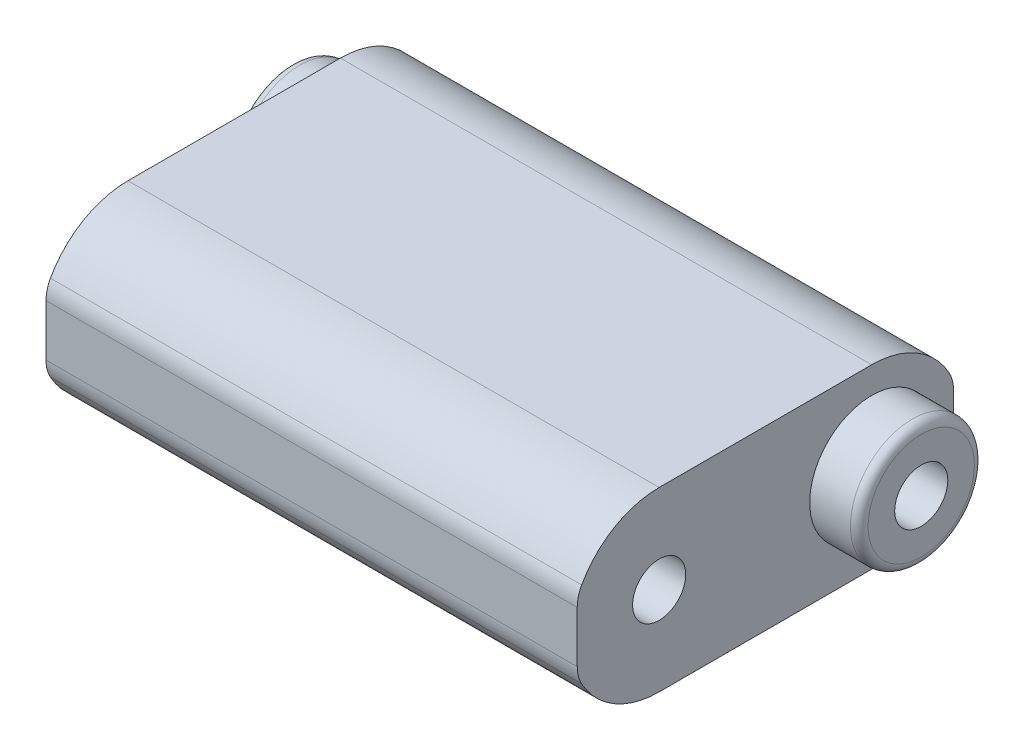
ISO-10303-21;
HEADER;
FILE_DESCRIPTION(('STEP AP214'),'2;1');
FILE_NAME('part.step','',(''),(''),'','','');
FILE_SCHEMA(('AUTOMOTIVE_DESIGN { 1 0 10303 214 1 1 1 1 }'));
ENDSEC;
DATA;
#1=APPLICATION_CONTEXT('core data for automotive mechanical design processes');
#2=APPLICATION_PROTOCOL_DEFINITION('international standard','automotive_design',2000,#1);
#3=PRODUCT_CONTEXT('',#1,'mechanical');
#4=PRODUCT('Part','Part','',(#3));
#5=PRODUCT_RELATED_PRODUCT_CATEGORY('part','',(#4));
#6=PRODUCT_DEFINITION_FORMATION('','',#4);
#7=PRODUCT_DEFINITION_CONTEXT('part definition',#1,'design');
#8=PRODUCT_DEFINITION('design','',#6,#7);
#9=PRODUCT_DEFINITION_SHAPE('','',#8);
#10=(LENGTH_UNIT() NAMED_UNIT(*) SI_UNIT(.MILLI.,.METRE.));
#11=(NAMED_UNIT(*) PLANE_ANGLE_UNIT() SI_UNIT($,.RADIAN.));
#12=(NAMED_UNIT(*) SI_UNIT($,.STERADIAN.) SOLID_ANGLE_UNIT());
#13=UNCERTAINTY_MEASURE_WITH_UNIT(LENGTH_MEASURE(1.E-05),#10,'distance_accuracy_value','');
#14=(GEOMETRIC_REPRESENTATION_CONTEXT(3) GLOBAL_UNCERTAINTY_ASSIGNED_CONTEXT((#13)) GLOBAL_UNIT_ASSIGNED_CONTEXT((#10,
#11,#12)) REPRESENTATION_CONTEXT('',''));
#15=CARTESIAN_POINT('',(0.,0.,0.));
#16=DIRECTION('',(0.,0.,1.));
#17=DIRECTION('',(1.,0.,0.));
#18=AXIS2_PLACEMENT_3D('',#15,#16,#17);
#19=CARTESIAN_POINT('',(300.,0.,0.));
#20=DIRECTION('',(1.,0.,0.));
#21=DIRECTION('',(0.,0.,-1.));
#22=AXIS2_PLACEMENT_3D('',#19,#20,#21);
#23=PLANE('',#22);
#24=DIRECTION('',(0.,-1.,0.));
#25=VECTOR('',#24,1.);
#26=CARTESIAN_POINT('',(300.,0.,106.249324319389));
#27=LINE('',#26,#25);
#28=CARTESIAN_POINT('',(300.,14.5249087011089,106.249324319389));
#29=VERTEX_POINT('',#28);
#30=CARTESIAN_POINT('',(300.,-14.5249087011089,106.249324319389));
#31=VERTEX_POINT('',#30);
#32=EDGE_CURVE('E170',#29,#31,#27,.T.);
#33=ORIENTED_EDGE('',*,*,#32,.T.);
#34=CARTESIAN_POINT('',(300.,-14.5249087011089,86.2493243193887));
#35=DIRECTION('',(1.,0.,0.));
#36=DIRECTION('',(0.,0.,-1.));
#37=AXIS2_PLACEMENT_3D('',#34,#35,#36);
#38=CIRCLE('',#37,20.);
#39=CARTESIAN_POINT('',(300.,-24.2081811685148,103.748873865648));
#40=VERTEX_POINT('',#39);
#41=EDGE_CURVE('E139',#31,#40,#38,.T.);
#42=ORIENTED_EDGE('',*,*,#41,.T.);
#43=CARTESIAN_POINT('',(300.,0.,60.));
#44=DIRECTION('',(1.,0.,0.));
#45=DIRECTION('',(0.,0.,-1.));
#46=AXIS2_PLACEMENT_3D('',#43,#44,#45);
#47=CIRCLE('',#46,50.);
#48=CARTESIAN_POINT('',(300.,-50.,60.));
#49=VERTEX_POINT('',#48);
#50=EDGE_CURVE('E131',#40,#49,#47,.T.);
#51=ORIENTED_EDGE('',*,*,#50,.T.);
#52=DIRECTION('',(0.,0.,1.));
#53=VECTOR('',#52,1.);
#54=CARTESIAN_POINT('',(300.,-50.,0.));
#55=LINE('',#54,#53);
#56=CARTESIAN_POINT('',(300.,-50.,-60.));
#57=VERTEX_POINT('',#56);
#58=EDGE_CURVE('E137',#57,#49,#55,.T.);
#59=ORIENTED_EDGE('',*,*,#58,.F.);
#60=CARTESIAN_POINT('',(300.,0.,-60.));
#61=DIRECTION('',(1.,0.,0.));
#62=DIRECTION('',(0.,0.,-1.));
#63=AXIS2_PLACEMENT_3D('',#60,#61,#62);
#64=CIRCLE('',#63,50.);
#65=CARTESIAN_POINT('',(300.,-24.2081811685148,-103.748873865648));
#66=VERTEX_POINT('',#65);
#67=EDGE_CURVE('E159',#57,#66,#64,.T.);
#68=ORIENTED_EDGE('',*,*,#67,.T.);
#69=CARTESIAN_POINT('',(300.,-14.5249087011089,-86.2493243193887));
#70=DIRECTION('',(1.,0.,0.));
#71=DIRECTION('',(0.,0.,-1.));
#72=AXIS2_PLACEMENT_3D('',#69,#70,#71);
#73=CIRCLE('',#72,20.);
#74=CARTESIAN_POINT('',(300.,-14.5249087011089,-106.249324319389));
#75=VERTEX_POINT('',#74);
#76=EDGE_CURVE('E225',#66,#75,#73,.T.);
#77=ORIENTED_EDGE('',*,*,#76,.T.);
#78=DIRECTION('',(0.,-1.,0.));
#79=VECTOR('',#78,1.);
#80=CARTESIAN_POINT('',(300.,0.,-106.249324319389));
#81=LINE('',#80,#79);
#82=CARTESIAN_POINT('',(300.,14.5249087011089,-106.249324319389));
#83=VERTEX_POINT('',#82);
#84=EDGE_CURVE('E161',#83,#75,#81,.T.);
#85=ORIENTED_EDGE('',*,*,#84,.F.);
#86=CARTESIAN_POINT('',(300.,14.5249087011089,-86.2493243193887));
#87=DIRECTION('',(1.,0.,0.));
#88=DIRECTION('',(0.,0.,-1.));
#89=AXIS2_PLACEMENT_3D('',#86,#87,#88);
#90=CIRCLE('',#89,20.);
#91=CARTESIAN_POINT('',(300.,24.2081811685149,-103.748873865648));
#92=VERTEX_POINT('',#91);
#93=EDGE_CURVE('E63',#83,#92,#90,.T.);
#94=ORIENTED_EDGE('',*,*,#93,.T.);
#95=CARTESIAN_POINT('',(300.,50.,-60.));
#96=VERTEX_POINT('',#95);
#97=EDGE_CURVE('E163',#92,#96,#64,.T.);
#98=ORIENTED_EDGE('',*,*,#97,.T.);
#99=DIRECTION('',(0.,0.,1.));
#100=VECTOR('',#99,1.);
#101=CARTESIAN_POINT('',(300.,50.,0.));
#102=LINE('',#101,#100);
#103=CARTESIAN_POINT('',(300.,50.,60.));
#104=VERTEX_POINT('',#103);
#105=EDGE_CURVE('E168',#96,#104,#102,.T.);
#106=ORIENTED_EDGE('',*,*,#105,.T.);
#107=CARTESIAN_POINT('',(300.,24.2081811685148,103.748873865648));
#108=VERTEX_POINT('',#107);
#109=EDGE_CURVE('E145',#104,#108,#47,.T.);
#110=ORIENTED_EDGE('',*,*,#109,.T.);
#111=CARTESIAN_POINT('',(300.,14.5249087011089,86.2493243193887));
#112=DIRECTION('',(1.,0.,0.));
#113=DIRECTION('',(0.,0.,-1.));
#114=AXIS2_PLACEMENT_3D('',#111,#112,#113);
#115=CIRCLE('',#114,20.);
#116=EDGE_CURVE('E227',#108,#29,#115,.T.);
#117=ORIENTED_EDGE('',*,*,#116,.T.);
#118=EDGE_LOOP('',(#33,#42,#51,#59,#68,#77,#85,#94,#98,#106,#110,#117));
#119=FACE_BOUND('',#118,.T.);
#120=CARTESIAN_POINT('',(300.,0.,60.));
#121=DIRECTION('',(-1.,0.,0.));
#122=DIRECTION('',(0.,0.,1.));
#123=AXIS2_PLACEMENT_3D('',#120,#121,#122);
#124=CIRCLE('',#123,15.);
#125=CARTESIAN_POINT('',(300.,0.,75.));
#126=VERTEX_POINT('',#125);
#127=EDGE_CURVE('E175',#126,#126,#124,.T.);
#128=ORIENTED_EDGE('',*,*,#127,.T.);
#129=EDGE_LOOP('',(#128));
#130=FACE_BOUND('',#129,.T.);
#131=CARTESIAN_POINT('',(300.,0.,-60.));
#132=DIRECTION('',(1.,0.,0.));
#133=DIRECTION('',(0.,0.,-1.));
#134=AXIS2_PLACEMENT_3D('',#131,#132,#133);
#135=CIRCLE('',#134,35.);
#136=CARTESIAN_POINT('',(300.,0.,-95.));
#137=VERTEX_POINT('',#136);
#138=EDGE_CURVE('E314',#137,#137,#135,.T.);
#139=ORIENTED_EDGE('',*,*,#138,.F.);
#140=EDGE_LOOP('',(#139));
#141=FACE_BOUND('',#140,.T.);
#142=ADVANCED_FACE('F40',(#119,#130,#141),#23,.T.);
#143=CARTESIAN_POINT('',(0.,0.,0.));
#144=DIRECTION('',(1.,0.,0.));
#145=DIRECTION('',(0.,0.,-1.));
#146=AXIS2_PLACEMENT_3D('',#143,#144,#145);
#147=PLANE('',#146);
#148=CARTESIAN_POINT('',(0.,0.,60.));
#149=DIRECTION('',(1.,0.,0.));
#150=DIRECTION('',(0.,0.,-1.));
#151=AXIS2_PLACEMENT_3D('',#148,#149,#150);
#152=CIRCLE('',#151,50.);
#153=CARTESIAN_POINT('',(0.,-24.2081811685148,103.748873865648));
#154=VERTEX_POINT('',#153);
#155=CARTESIAN_POINT('',(0.,-50.,60.));
#156=VERTEX_POINT('',#155);
#157=EDGE_CURVE('E150',#154,#156,#152,.T.);
#158=ORIENTED_EDGE('',*,*,#157,.F.);
#159=CARTESIAN_POINT('',(0.,-14.5249087011089,86.2493243193887));
#160=DIRECTION('',(1.,0.,0.));
#161=DIRECTION('',(0.,0.,-1.));
#162=AXIS2_PLACEMENT_3D('',#159,#160,#161);
#163=CIRCLE('',#162,20.);
#164=CARTESIAN_POINT('',(0.,-14.5249087011089,106.249324319389));
#165=VERTEX_POINT('',#164);
#166=EDGE_CURVE('E217',#154,#165,#163,.F.);
#167=ORIENTED_EDGE('',*,*,#166,.T.);
#168=DIRECTION('',(0.,-1.,0.));
#169=VECTOR('',#168,1.);
#170=CARTESIAN_POINT('',(0.,0.,106.249324319389));
#171=LINE('',#170,#169);
#172=CARTESIAN_POINT('',(0.,14.5249087011089,106.249324319389));
#173=VERTEX_POINT('',#172);
#174=EDGE_CURVE('E143',#173,#165,#171,.T.);
#175=ORIENTED_EDGE('',*,*,#174,.F.);
#176=CARTESIAN_POINT('',(0.,14.5249087011089,86.2493243193887));
#177=DIRECTION('',(1.,0.,0.));
#178=DIRECTION('',(0.,0.,-1.));
#179=AXIS2_PLACEMENT_3D('',#176,#177,#178);
#180=CIRCLE('',#179,20.);
#181=CARTESIAN_POINT('',(0.,24.2081811685148,103.748873865648));
#182=VERTEX_POINT('',#181);
#183=EDGE_CURVE('E215',#173,#182,#180,.F.);
#184=ORIENTED_EDGE('',*,*,#183,.T.);
#185=CARTESIAN_POINT('',(0.,50.,60.));
#186=VERTEX_POINT('',#185);
#187=EDGE_CURVE('E176',#186,#182,#152,.T.);
#188=ORIENTED_EDGE('',*,*,#187,.F.);
#189=DIRECTION('',(0.,0.,1.));
#190=VECTOR('',#189,1.);
#191=CARTESIAN_POINT('',(0.,50.,0.));
#192=LINE('',#191,#190);
#193=CARTESIAN_POINT('',(0.,50.,-60.));
#194=VERTEX_POINT('',#193);
#195=EDGE_CURVE('E185',#194,#186,#192,.T.);
#196=ORIENTED_EDGE('',*,*,#195,.F.);
#197=CARTESIAN_POINT('',(0.,0.,-60.));
#198=DIRECTION('',(1.,0.,0.));
#199=DIRECTION('',(0.,0.,-1.));
#200=AXIS2_PLACEMENT_3D('',#197,#198,#199);
#201=CIRCLE('',#200,50.);
#202=CARTESIAN_POINT('',(0.,24.2081811685149,-103.748873865648));
#203=VERTEX_POINT('',#202);
#204=EDGE_CURVE('E182',#203,#194,#201,.T.);
#205=ORIENTED_EDGE('',*,*,#204,.F.);
#206=CARTESIAN_POINT('',(0.,14.5249087011089,-86.2493243193887));
#207=DIRECTION('',(1.,0.,0.));
#208=DIRECTION('',(0.,0.,-1.));
#209=AXIS2_PLACEMENT_3D('',#206,#207,#208);
#210=CIRCLE('',#209,20.);
#211=CARTESIAN_POINT('',(0.,14.5249087011089,-106.249324319389));
#212=VERTEX_POINT('',#211);
#213=EDGE_CURVE('E211',#203,#212,#210,.F.);
#214=ORIENTED_EDGE('',*,*,#213,.T.);
#215=DIRECTION('',(0.,-1.,0.));
#216=VECTOR('',#215,1.);
#217=CARTESIAN_POINT('',(0.,0.,-106.249324319389));
#218=LINE('',#217,#216);
#219=CARTESIAN_POINT('',(0.,-14.5249087011089,-106.249324319389));
#220=VERTEX_POINT('',#219);
#221=EDGE_CURVE('E181',#212,#220,#218,.T.);
#222=ORIENTED_EDGE('',*,*,#221,.T.);
#223=CARTESIAN_POINT('',(0.,-14.5249087011089,-86.2493243193887));
#224=DIRECTION('',(1.,0.,0.));
#225=DIRECTION('',(0.,0.,-1.));
#226=AXIS2_PLACEMENT_3D('',#223,#224,#225);
#227=CIRCLE('',#226,20.);
#228=CARTESIAN_POINT('',(0.,-24.2081811685148,-103.748873865648));
#229=VERTEX_POINT('',#228);
#230=EDGE_CURVE('E213',#220,#229,#227,.F.);
#231=ORIENTED_EDGE('',*,*,#230,.T.);
#232=CARTESIAN_POINT('',(0.,-50.,-60.));
#233=VERTEX_POINT('',#232);
#234=EDGE_CURVE('E178',#233,#229,#201,.T.);
#235=ORIENTED_EDGE('',*,*,#234,.F.);
#236=DIRECTION('',(0.,0.,1.));
#237=VECTOR('',#236,1.);
#238=CARTESIAN_POINT('',(0.,-50.,0.));
#239=LINE('',#238,#237);
#240=EDGE_CURVE('E174',#233,#156,#239,.T.);
#241=ORIENTED_EDGE('',*,*,#240,.T.);
#242=EDGE_LOOP('',(#158,#167,#175,#184,#188,#196,#205,#214,#222,#231,#235,#241));
#243=FACE_BOUND('',#242,.T.);
#244=CARTESIAN_POINT('',(0.,0.,60.));
#245=DIRECTION('',(-1.,0.,0.));
#246=DIRECTION('',(0.,0.,1.));
#247=AXIS2_PLACEMENT_3D('',#244,#245,#246);
#248=CIRCLE('',#247,15.);
#249=CARTESIAN_POINT('',(0.,0.,75.));
#250=VERTEX_POINT('',#249);
#251=EDGE_CURVE('E322',#250,#250,#248,.T.);
#252=ORIENTED_EDGE('',*,*,#251,.F.);
#253=EDGE_LOOP('',(#252));
#254=FACE_BOUND('',#253,.T.);
#255=CARTESIAN_POINT('',(0.,0.,-60.));
#256=DIRECTION('',(1.,0.,0.));
#257=DIRECTION('',(0.,0.,-1.));
#258=AXIS2_PLACEMENT_3D('',#255,#256,#257);
#259=CIRCLE('',#258,35.);
#260=CARTESIAN_POINT('',(0.,0.,-95.));
#261=VERTEX_POINT('',#260);
#262=EDGE_CURVE('E154',#261,#261,#259,.F.);
#263=ORIENTED_EDGE('',*,*,#262,.F.);
#264=EDGE_LOOP('',(#263));
#265=FACE_BOUND('',#264,.T.);
#266=ADVANCED_FACE('F248',(#243,#254,#265),#147,.F.);
#267=CARTESIAN_POINT('',(300.,0.,60.));
#268=DIRECTION('',(-1.,0.,0.));
#269=DIRECTION('',(0.,0.,1.));
#270=AXIS2_PLACEMENT_3D('',#267,#268,#269);
#271=CYLINDRICAL_SURFACE('',#270,50.);
#272=ORIENTED_EDGE('',*,*,#50,.F.);
#273=DIRECTION('',(-1.,0.,0.));
#274=VECTOR('',#273,1.);
#275=CARTESIAN_POINT('',(300.,-24.2081811685148,103.748873865648));
#276=LINE('',#275,#274);
#277=EDGE_CURVE('E209',#40,#154,#276,.T.);
#278=ORIENTED_EDGE('',*,*,#277,.T.);
#279=ORIENTED_EDGE('',*,*,#157,.T.);
#280=DIRECTION('',(-1.,0.,0.));
#281=VECTOR('',#280,1.);
#282=CARTESIAN_POINT('',(300.,-50.,60.));
#283=LINE('',#282,#281);
#284=EDGE_CURVE('E147',#49,#156,#283,.T.);
#285=ORIENTED_EDGE('',*,*,#284,.F.);
#286=EDGE_LOOP('',(#272,#278,#279,#285));
#287=FACE_BOUND('',#286,.T.);
#288=ADVANCED_FACE('F148',(#287),#271,.T.);
#289=CARTESIAN_POINT('',(300.,-50.,0.));
#290=DIRECTION('',(0.,-1.,0.));
#291=DIRECTION('',(0.,0.,-1.));
#292=AXIS2_PLACEMENT_3D('',#289,#290,#291);
#293=PLANE('',#292);
#294=ORIENTED_EDGE('',*,*,#240,.F.);
#295=DIRECTION('',(-1.,0.,0.));
#296=VECTOR('',#295,1.);
#297=CARTESIAN_POINT('',(300.,-50.,-60.));
#298=LINE('',#297,#296);
#299=EDGE_CURVE('E155',#57,#233,#298,.T.);
#300=ORIENTED_EDGE('',*,*,#299,.F.);
#301=ORIENTED_EDGE('',*,*,#58,.T.);
#302=ORIENTED_EDGE('',*,*,#284,.T.);
#303=EDGE_LOOP('',(#294,#300,#301,#302));
#304=FACE_BOUND('',#303,.T.);
#305=ADVANCED_FACE('F157',(#304),#293,.T.);
#306=CARTESIAN_POINT('',(300.,0.,-60.));
#307=DIRECTION('',(-1.,0.,0.));
#308=DIRECTION('',(0.,0.,1.));
#309=AXIS2_PLACEMENT_3D('',#306,#307,#308);
#310=CYLINDRICAL_SURFACE('',#309,50.);
#311=ORIENTED_EDGE('',*,*,#234,.T.);
#312=DIRECTION('',(-1.,0.,0.));
#313=VECTOR('',#312,1.);
#314=CARTESIAN_POINT('',(300.,-24.2081811685148,-103.748873865648));
#315=LINE('',#314,#313);
#316=EDGE_CURVE('E48',#229,#66,#315,.F.);
#317=ORIENTED_EDGE('',*,*,#316,.T.);
#318=ORIENTED_EDGE('',*,*,#67,.F.);
#319=ORIENTED_EDGE('',*,*,#299,.T.);
#320=EDGE_LOOP('',(#311,#317,#318,#319));
#321=FACE_BOUND('',#320,.T.);
#322=ADVANCED_FACE('F237',(#321),#310,.T.);
#323=CARTESIAN_POINT('',(300.,0.,-106.249324319389));
#324=DIRECTION('',(0.,0.,-1.));
#325=DIRECTION('',(0.,1.,0.));
#326=AXIS2_PLACEMENT_3D('',#323,#324,#325);
#327=PLANE('',#326);
#328=ORIENTED_EDGE('',*,*,#84,.T.);
#329=DIRECTION('',(1.,0.,0.));
#330=VECTOR('',#329,1.);
#331=CARTESIAN_POINT('',(0.,-14.5249087011089,-106.249324319389));
#332=LINE('',#331,#330);
#333=EDGE_CURVE('E233',#75,#220,#332,.F.);
#334=ORIENTED_EDGE('',*,*,#333,.T.);
#335=ORIENTED_EDGE('',*,*,#221,.F.);
#336=DIRECTION('',(1.,0.,0.));
#337=VECTOR('',#336,1.);
#338=CARTESIAN_POINT('',(300.,14.5249087011089,-106.249324319389));
#339=LINE('',#338,#337);
#340=EDGE_CURVE('E231',#212,#83,#339,.T.);
#341=ORIENTED_EDGE('',*,*,#340,.T.);
#342=EDGE_LOOP('',(#328,#334,#335,#341));
#343=FACE_BOUND('',#342,.T.);
#344=ADVANCED_FACE('F245',(#343),#327,.T.);
#345=ORIENTED_EDGE('',*,*,#97,.F.);
#346=DIRECTION('',(-1.,0.,0.));
#347=VECTOR('',#346,1.);
#348=CARTESIAN_POINT('',(300.,24.2081811685149,-103.748873865648));
#349=LINE('',#348,#347);
#350=EDGE_CURVE('E11',#92,#203,#349,.T.);
#351=ORIENTED_EDGE('',*,*,#350,.T.);
#352=ORIENTED_EDGE('',*,*,#204,.T.);
#353=DIRECTION('',(-1.,0.,0.));
#354=VECTOR('',#353,1.);
#355=CARTESIAN_POINT('',(300.,50.,-60.));
#356=LINE('',#355,#354);
#357=EDGE_CURVE('E191',#96,#194,#356,.T.);
#358=ORIENTED_EDGE('',*,*,#357,.F.);
#359=EDGE_LOOP('',(#345,#351,#352,#358));
#360=FACE_BOUND('',#359,.T.);
#361=ADVANCED_FACE('F255',(#360),#310,.T.);
#362=CARTESIAN_POINT('',(300.,50.,0.));
#363=DIRECTION('',(0.,-1.,0.));
#364=DIRECTION('',(0.,0.,-1.));
#365=AXIS2_PLACEMENT_3D('',#362,#363,#364);
#366=PLANE('',#365);
#367=ORIENTED_EDGE('',*,*,#195,.T.);
#368=DIRECTION('',(-1.,0.,0.));
#369=VECTOR('',#368,1.);
#370=CARTESIAN_POINT('',(300.,50.,60.));
#371=LINE('',#370,#369);
#372=EDGE_CURVE('E172',#104,#186,#371,.T.);
#373=ORIENTED_EDGE('',*,*,#372,.F.);
#374=ORIENTED_EDGE('',*,*,#105,.F.);
#375=ORIENTED_EDGE('',*,*,#357,.T.);
#376=EDGE_LOOP('',(#367,#373,#374,#375));
#377=FACE_BOUND('',#376,.T.);
#378=ADVANCED_FACE('F261',(#377),#366,.F.);
#379=ORIENTED_EDGE('',*,*,#187,.T.);
#380=DIRECTION('',(-1.,0.,0.));
#381=VECTOR('',#380,1.);
#382=CARTESIAN_POINT('',(300.,24.2081811685149,103.748873865648));
#383=LINE('',#382,#381);
#384=EDGE_CURVE('E55',#182,#108,#383,.F.);
#385=ORIENTED_EDGE('',*,*,#384,.T.);
#386=ORIENTED_EDGE('',*,*,#109,.F.);
#387=ORIENTED_EDGE('',*,*,#372,.T.);
#388=EDGE_LOOP('',(#379,#385,#386,#387));
#389=FACE_BOUND('',#388,.T.);
#390=ADVANCED_FACE('F263',(#389),#271,.T.);
#391=CARTESIAN_POINT('',(300.,0.,106.249324319389));
#392=DIRECTION('',(0.,0.,-1.));
#393=DIRECTION('',(0.,1.,0.));
#394=AXIS2_PLACEMENT_3D('',#391,#392,#393);
#395=PLANE('',#394);
#396=ORIENTED_EDGE('',*,*,#174,.T.);
#397=DIRECTION('',(-1.,0.,0.));
#398=VECTOR('',#397,1.);
#399=CARTESIAN_POINT('',(300.,-14.5249087011089,106.249324319389));
#400=LINE('',#399,#398);
#401=EDGE_CURVE('E222',#165,#31,#400,.F.);
#402=ORIENTED_EDGE('',*,*,#401,.T.);
#403=ORIENTED_EDGE('',*,*,#32,.F.);
#404=DIRECTION('',(-1.,0.,0.));
#405=VECTOR('',#404,1.);
#406=CARTESIAN_POINT('',(300.,14.5249087011089,106.249324319389));
#407=LINE('',#406,#405);
#408=EDGE_CURVE('E219',#29,#173,#407,.T.);
#409=ORIENTED_EDGE('',*,*,#408,.T.);
#410=EDGE_LOOP('',(#396,#402,#403,#409));
#411=FACE_BOUND('',#410,.T.);
#412=ADVANCED_FACE('F265',(#411),#395,.F.);
#413=CARTESIAN_POINT('',(300.,0.,-60.));
#414=DIRECTION('',(-1.,0.,0.));
#415=DIRECTION('',(0.,0.,1.));
#416=AXIS2_PLACEMENT_3D('',#413,#414,#415);
#417=CYLINDRICAL_SURFACE('',#416,15.);
#418=CARTESIAN_POINT('',(-28.,0.,-60.));
#419=DIRECTION('',(-1.,0.,0.));
#420=DIRECTION('',(0.,0.,1.));
#421=AXIS2_PLACEMENT_3D('',#418,#419,#420);
#422=CIRCLE('',#421,15.);
#423=CARTESIAN_POINT('',(-28.,0.,-45.));
#424=VERTEX_POINT('',#423);
#425=EDGE_CURVE('E317',#424,#424,#422,.T.);
#426=ORIENTED_EDGE('',*,*,#425,.T.);
#427=EDGE_LOOP('',(#426));
#428=FACE_BOUND('',#427,.T.);
#429=CARTESIAN_POINT('',(328.,0.,-60.));
#430=DIRECTION('',(1.,0.,0.));
#431=DIRECTION('',(0.,0.,-1.));
#432=AXIS2_PLACEMENT_3D('',#429,#430,#431);
#433=CIRCLE('',#432,15.);
#434=CARTESIAN_POINT('',(328.,0.,-75.));
#435=VERTEX_POINT('',#434);
#436=EDGE_CURVE('E312',#435,#435,#433,.T.);
#437=ORIENTED_EDGE('',*,*,#436,.T.);
#438=EDGE_LOOP('',(#437));
#439=FACE_BOUND('',#438,.T.);
#440=ADVANCED_FACE('F271',(#428,#439),#417,.F.);
#441=CARTESIAN_POINT('',(300.,0.,60.));
#442=DIRECTION('',(-1.,0.,0.));
#443=DIRECTION('',(0.,0.,1.));
#444=AXIS2_PLACEMENT_3D('',#441,#442,#443);
#445=CYLINDRICAL_SURFACE('',#444,15.);
#446=ORIENTED_EDGE('',*,*,#127,.F.);
#447=EDGE_LOOP('',(#446));
#448=FACE_BOUND('',#447,.T.);
#449=ORIENTED_EDGE('',*,*,#251,.T.);
#450=EDGE_LOOP('',(#449));
#451=FACE_BOUND('',#450,.T.);
#452=ADVANCED_FACE('F285',(#448,#451),#445,.F.);
#453=CARTESIAN_POINT('',(-28.,0.,-60.));
#454=DIRECTION('',(-1.,0.,0.));
#455=DIRECTION('',(0.,0.,1.));
#456=AXIS2_PLACEMENT_3D('',#453,#454,#455);
#457=PLANE('',#456);
#458=CARTESIAN_POINT('',(-28.,0.,-60.));
#459=DIRECTION('',(-1.,0.,0.));
#460=DIRECTION('',(0.,0.,1.));
#461=AXIS2_PLACEMENT_3D('',#458,#459,#460);
#462=CIRCLE('',#461,30.);
#463=CARTESIAN_POINT('',(-28.,0.,-30.));
#464=VERTEX_POINT('',#463);
#465=EDGE_CURVE('E197',#464,#464,#462,.T.);
#466=ORIENTED_EDGE('',*,*,#465,.T.);
#467=EDGE_LOOP('',(#466));
#468=FACE_BOUND('',#467,.T.);
#469=ORIENTED_EDGE('',*,*,#425,.F.);
#470=EDGE_LOOP('',(#469));
#471=FACE_BOUND('',#470,.T.);
#472=ADVANCED_FACE('F289',(#468,#471),#457,.T.);
#473=CARTESIAN_POINT('',(-28.,0.,-60.));
#474=DIRECTION('',(1.,0.,0.));
#475=DIRECTION('',(0.,0.,-1.));
#476=AXIS2_PLACEMENT_3D('',#473,#474,#475);
#477=CYLINDRICAL_SURFACE('',#476,35.);
#478=CARTESIAN_POINT('',(-23.,0.,-60.));
#479=DIRECTION('',(-1.,0.,0.));
#480=DIRECTION('',(0.,0.,1.));
#481=AXIS2_PLACEMENT_3D('',#478,#479,#480);
#482=CIRCLE('',#481,35.);
#483=CARTESIAN_POINT('',(-23.,0.,-25.));
#484=VERTEX_POINT('',#483);
#485=EDGE_CURVE('E200',#484,#484,#482,.F.);
#486=ORIENTED_EDGE('',*,*,#485,.T.);
#487=EDGE_LOOP('',(#486));
#488=FACE_BOUND('',#487,.T.);
#489=ORIENTED_EDGE('',*,*,#262,.T.);
#490=EDGE_LOOP('',(#489));
#491=FACE_BOUND('',#490,.T.);
#492=ADVANCED_FACE('F291',(#488,#491),#477,.T.);
#493=CARTESIAN_POINT('',(328.,0.,-60.));
#494=DIRECTION('',(1.,0.,0.));
#495=DIRECTION('',(0.,0.,-1.));
#496=AXIS2_PLACEMENT_3D('',#493,#494,#495);
#497=PLANE('',#496);
#498=CARTESIAN_POINT('',(328.,0.,-60.));
#499=DIRECTION('',(1.,0.,0.));
#500=DIRECTION('',(0.,0.,-1.));
#501=AXIS2_PLACEMENT_3D('',#498,#499,#500);
#502=CIRCLE('',#501,30.);
#503=CARTESIAN_POINT('',(328.,0.,-90.));
#504=VERTEX_POINT('',#503);
#505=EDGE_CURVE('E203',#504,#504,#502,.T.);
#506=ORIENTED_EDGE('',*,*,#505,.T.);
#507=EDGE_LOOP('',(#506));
#508=FACE_BOUND('',#507,.T.);
#509=ORIENTED_EDGE('',*,*,#436,.F.);
#510=EDGE_LOOP('',(#509));
#511=FACE_BOUND('',#510,.T.);
#512=ADVANCED_FACE('F294',(#508,#511),#497,.T.);
#513=CARTESIAN_POINT('',(328.,0.,-60.));
#514=DIRECTION('',(-1.,0.,0.));
#515=DIRECTION('',(0.,0.,1.));
#516=AXIS2_PLACEMENT_3D('',#513,#514,#515);
#517=CYLINDRICAL_SURFACE('',#516,35.);
#518=CARTESIAN_POINT('',(323.,0.,-60.));
#519=DIRECTION('',(1.,0.,0.));
#520=DIRECTION('',(0.,0.,-1.));
#521=AXIS2_PLACEMENT_3D('',#518,#519,#520);
#522=CIRCLE('',#521,35.);
#523=CARTESIAN_POINT('',(323.,0.,-95.));
#524=VERTEX_POINT('',#523);
#525=EDGE_CURVE('E206',#524,#524,#522,.F.);
#526=ORIENTED_EDGE('',*,*,#525,.T.);
#527=EDGE_LOOP('',(#526));
#528=FACE_BOUND('',#527,.T.);
#529=ORIENTED_EDGE('',*,*,#138,.T.);
#530=EDGE_LOOP('',(#529));
#531=FACE_BOUND('',#530,.T.);
#532=ADVANCED_FACE('F299',(#528,#531),#517,.T.);
#533=CARTESIAN_POINT('',(-23.,0.,-60.));
#534=DIRECTION('',(-1.,0.,0.));
#535=DIRECTION('',(0.,0.,1.));
#536=AXIS2_PLACEMENT_3D('',#533,#534,#535);
#537=TOROIDAL_SURFACE('',#536,30.,5.);
#538=ORIENTED_EDGE('',*,*,#485,.F.);
#539=EDGE_LOOP('',(#538));
#540=FACE_BOUND('',#539,.T.);
#541=ORIENTED_EDGE('',*,*,#465,.F.);
#542=EDGE_LOOP('',(#541));
#543=FACE_BOUND('',#542,.T.);
#544=ADVANCED_FACE('F302',(#540,#543),#537,.T.);
#545=CARTESIAN_POINT('',(323.,0.,-60.));
#546=DIRECTION('',(1.,0.,0.));
#547=DIRECTION('',(0.,0.,-1.));
#548=AXIS2_PLACEMENT_3D('',#545,#546,#547);
#549=TOROIDAL_SURFACE('',#548,30.,5.);
#550=ORIENTED_EDGE('',*,*,#525,.F.);
#551=EDGE_LOOP('',(#550));
#552=FACE_BOUND('',#551,.T.);
#553=ORIENTED_EDGE('',*,*,#505,.F.);
#554=EDGE_LOOP('',(#553));
#555=FACE_BOUND('',#554,.T.);
#556=ADVANCED_FACE('F337',(#552,#555),#549,.T.);
#557=CARTESIAN_POINT('',(300.,-14.5249087011089,86.2493243193887));
#558=DIRECTION('',(-1.,0.,0.));
#559=DIRECTION('',(0.,0.,1.));
#560=AXIS2_PLACEMENT_3D('',#557,#558,#559);
#561=CYLINDRICAL_SURFACE('',#560,20.);
#562=ORIENTED_EDGE('',*,*,#41,.F.);
#563=ORIENTED_EDGE('',*,*,#401,.F.);
#564=ORIENTED_EDGE('',*,*,#166,.F.);
#565=ORIENTED_EDGE('',*,*,#277,.F.);
#566=EDGE_LOOP('',(#562,#563,#564,#565));
#567=FACE_BOUND('',#566,.T.);
#568=ADVANCED_FACE('F339',(#567),#561,.T.);
#569=CARTESIAN_POINT('',(300.,14.5249087011089,86.2493243193887));
#570=DIRECTION('',(-1.,0.,0.));
#571=DIRECTION('',(0.,0.,1.));
#572=AXIS2_PLACEMENT_3D('',#569,#570,#571);
#573=CYLINDRICAL_SURFACE('',#572,20.);
#574=ORIENTED_EDGE('',*,*,#116,.F.);
#575=ORIENTED_EDGE('',*,*,#384,.F.);
#576=ORIENTED_EDGE('',*,*,#183,.F.);
#577=ORIENTED_EDGE('',*,*,#408,.F.);
#578=EDGE_LOOP('',(#574,#575,#576,#577));
#579=FACE_BOUND('',#578,.T.);
#580=ADVANCED_FACE('F346',(#579),#573,.T.);
#581=CARTESIAN_POINT('',(300.,-14.5249087011089,-86.2493243193887));
#582=DIRECTION('',(-1.,0.,0.));
#583=DIRECTION('',(0.,0.,1.));
#584=AXIS2_PLACEMENT_3D('',#581,#582,#583);
#585=CYLINDRICAL_SURFACE('',#584,20.);
#586=ORIENTED_EDGE('',*,*,#76,.F.);
#587=ORIENTED_EDGE('',*,*,#316,.F.);
#588=ORIENTED_EDGE('',*,*,#230,.F.);
#589=ORIENTED_EDGE('',*,*,#333,.F.);
#590=EDGE_LOOP('',(#586,#587,#588,#589));
#591=FACE_BOUND('',#590,.T.);
#592=ADVANCED_FACE('F242',(#591),#585,.T.);
#593=CARTESIAN_POINT('',(300.,14.5249087011089,-86.2493243193887));
#594=DIRECTION('',(-1.,0.,0.));
#595=DIRECTION('',(0.,0.,1.));
#596=AXIS2_PLACEMENT_3D('',#593,#594,#595);
#597=CYLINDRICAL_SURFACE('',#596,20.);
#598=ORIENTED_EDGE('',*,*,#93,.F.);
#599=ORIENTED_EDGE('',*,*,#340,.F.);
#600=ORIENTED_EDGE('',*,*,#213,.F.);
#601=ORIENTED_EDGE('',*,*,#350,.F.);
#602=EDGE_LOOP('',(#598,#599,#600,#601));
#603=FACE_BOUND('',#602,.T.);
#604=ADVANCED_FACE('F42',(#603),#597,.T.);
#605=CLOSED_SHELL('',(#142,#266,#288,#305,#322,#344,#361,#378,#390,#412,#440,#452,#472,#492,
#512,#532,#544,#556,#568,#580,#592,#604));
#606=MANIFOLD_SOLID_BREP('B2',#605);
#607=ADVANCED_BREP_SHAPE_REPRESENTATION('',(#18,#606),#14);
#608=SHAPE_DEFINITION_REPRESENTATION(#9,#607);
ENDSEC;
END-ISO-10303-21;
